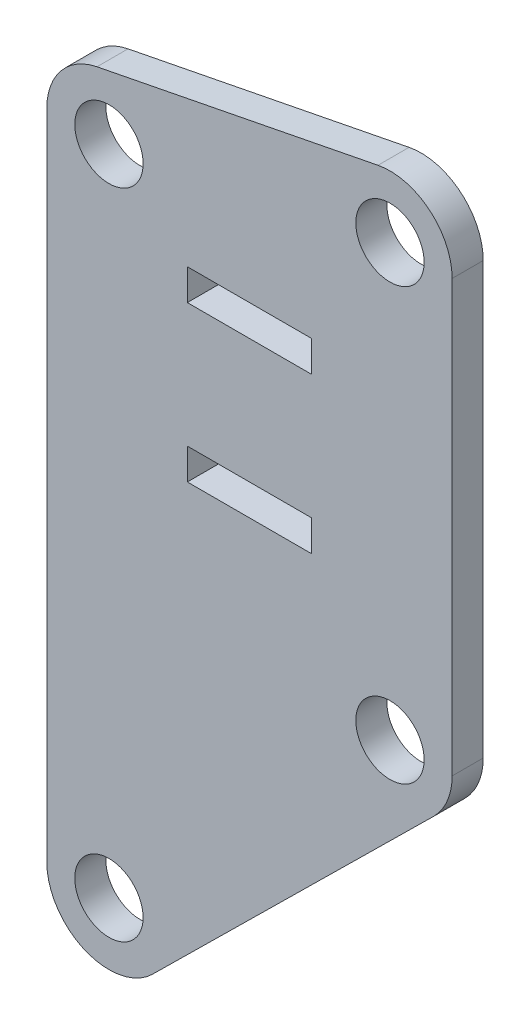
ISO-10303-21;
HEADER;
FILE_DESCRIPTION(('STEP AP214'),'2;1');
FILE_NAME('part.step','',(''),(''),'','','');
FILE_SCHEMA(('AUTOMOTIVE_DESIGN { 1 0 10303 214 1 1 1 1 }'));
ENDSEC;
DATA;
#1=APPLICATION_CONTEXT('core data for automotive mechanical design processes');
#2=APPLICATION_PROTOCOL_DEFINITION('international standard','automotive_design',2000,#1);
#3=PRODUCT_CONTEXT('',#1,'mechanical');
#4=PRODUCT('Part','Part','',(#3));
#5=PRODUCT_RELATED_PRODUCT_CATEGORY('part','',(#4));
#6=PRODUCT_DEFINITION_FORMATION('','',#4);
#7=PRODUCT_DEFINITION_CONTEXT('part definition',#1,'design');
#8=PRODUCT_DEFINITION('design','',#6,#7);
#9=PRODUCT_DEFINITION_SHAPE('','',#8);
#10=(LENGTH_UNIT() NAMED_UNIT(*) SI_UNIT(.MILLI.,.METRE.));
#11=(NAMED_UNIT(*) PLANE_ANGLE_UNIT() SI_UNIT($,.RADIAN.));
#12=(NAMED_UNIT(*) SI_UNIT($,.STERADIAN.) SOLID_ANGLE_UNIT());
#13=UNCERTAINTY_MEASURE_WITH_UNIT(LENGTH_MEASURE(1.E-05),#10,'distance_accuracy_value','');
#14=(GEOMETRIC_REPRESENTATION_CONTEXT(3) GLOBAL_UNCERTAINTY_ASSIGNED_CONTEXT((#13)) GLOBAL_UNIT_ASSIGNED_CONTEXT((#10,
#11,#12)) REPRESENTATION_CONTEXT('',''));
#15=CARTESIAN_POINT('',(0.,0.,0.));
#16=DIRECTION('',(0.,0.,1.));
#17=DIRECTION('',(1.,0.,0.));
#18=AXIS2_PLACEMENT_3D('',#15,#16,#17);
#19=CARTESIAN_POINT('',(-22.6126063288709,-56.9697358613956,5.));
#20=DIRECTION('',(0.,0.,-1.));
#21=DIRECTION('',(-1.,0.,0.));
#22=AXIS2_PLACEMENT_3D('',#19,#20,#21);
#23=CYLINDRICAL_SURFACE('',#22,10.);
#24=CARTESIAN_POINT('',(-22.6126063288709,-56.9697358613956,0.));
#25=DIRECTION('',(0.,0.,1.));
#26=DIRECTION('',(1.,0.,0.));
#27=AXIS2_PLACEMENT_3D('',#24,#25,#26);
#28=CIRCLE('',#27,10.);
#29=CARTESIAN_POINT('',(-32.6126063288709,-56.9697358613957,0.));
#30=VERTEX_POINT('',#29);
#31=CARTESIAN_POINT('',(-15.5903831558637,-64.0893132160201,0.));
#32=VERTEX_POINT('',#31);
#33=EDGE_CURVE('E204',#30,#32,#28,.T.);
#34=ORIENTED_EDGE('',*,*,#33,.T.);
#35=DIRECTION('',(0.,0.,-1.));
#36=VECTOR('',#35,1.);
#37=CARTESIAN_POINT('',(-15.5903831558637,-64.0893132160201,5.));
#38=LINE('',#37,#36);
#39=CARTESIAN_POINT('',(-15.5903831558637,-64.0893132160201,5.));
#40=VERTEX_POINT('',#39);
#41=EDGE_CURVE('E11',#40,#32,#38,.T.);
#42=ORIENTED_EDGE('',*,*,#41,.F.);
#43=CARTESIAN_POINT('',(-22.6126063288709,-56.9697358613956,5.));
#44=DIRECTION('',(0.,0.,1.));
#45=DIRECTION('',(1.,0.,0.));
#46=AXIS2_PLACEMENT_3D('',#43,#44,#45);
#47=CIRCLE('',#46,10.);
#48=CARTESIAN_POINT('',(-32.6126063288709,-56.9697358613957,5.));
#49=VERTEX_POINT('',#48);
#50=EDGE_CURVE('E253',#49,#40,#47,.T.);
#51=ORIENTED_EDGE('',*,*,#50,.F.);
#52=DIRECTION('',(0.,0.,-1.));
#53=VECTOR('',#52,1.);
#54=CARTESIAN_POINT('',(-32.6126063288709,-56.9697358613957,5.));
#55=LINE('',#54,#53);
#56=EDGE_CURVE('E279',#49,#30,#55,.T.);
#57=ORIENTED_EDGE('',*,*,#56,.T.);
#58=EDGE_LOOP('',(#34,#42,#51,#57));
#59=FACE_BOUND('',#58,.T.);
#60=ADVANCED_FACE('F42',(#59),#23,.T.);
#61=CARTESIAN_POINT('',(-15.5903831558637,-64.0893132160201,5.));
#62=DIRECTION('',(-0.702222317300717,0.711957735462444,0.));
#63=DIRECTION('',(-0.711957735462444,-0.702222317300717,0.));
#64=AXIS2_PLACEMENT_3D('',#61,#62,#63);
#65=PLANE('',#64);
#66=DIRECTION('',(0.711957735462444,0.702222317300717,0.));
#67=VECTOR('',#66,1.);
#68=CARTESIAN_POINT('',(-15.5903831558637,-64.0893132160201,0.));
#69=LINE('',#68,#67);
#70=CARTESIAN_POINT('',(29.6348295018789,-19.4825169820982,0.));
#71=VERTEX_POINT('',#70);
#72=EDGE_CURVE('E283',#32,#71,#69,.T.);
#73=ORIENTED_EDGE('',*,*,#72,.T.);
#74=DIRECTION('',(0.,0.,-1.));
#75=VECTOR('',#74,1.);
#76=CARTESIAN_POINT('',(29.6348295018789,-19.4825169820982,5.));
#77=LINE('',#76,#75);
#78=CARTESIAN_POINT('',(29.6348295018789,-19.4825169820982,5.));
#79=VERTEX_POINT('',#78);
#80=EDGE_CURVE('E50',#79,#71,#77,.T.);
#81=ORIENTED_EDGE('',*,*,#80,.F.);
#82=DIRECTION('',(0.711957735462444,0.702222317300717,0.));
#83=VECTOR('',#82,1.);
#84=CARTESIAN_POINT('',(-15.5903831558637,-64.0893132160201,5.));
#85=LINE('',#84,#83);
#86=EDGE_CURVE('E257',#40,#79,#85,.T.);
#87=ORIENTED_EDGE('',*,*,#86,.F.);
#88=ORIENTED_EDGE('',*,*,#41,.T.);
#89=EDGE_LOOP('',(#73,#81,#87,#88));
#90=FACE_BOUND('',#89,.T.);
#91=ADVANCED_FACE('F353',(#90),#65,.F.);
#92=CARTESIAN_POINT('',(22.6126063288717,-12.3629396274737,5.));
#93=DIRECTION('',(0.,0.,-1.));
#94=DIRECTION('',(-1.,0.,0.));
#95=AXIS2_PLACEMENT_3D('',#92,#93,#94);
#96=CYLINDRICAL_SURFACE('',#95,10.);
#97=CARTESIAN_POINT('',(22.6126063288717,-12.3629396274737,0.));
#98=DIRECTION('',(0.,0.,1.));
#99=DIRECTION('',(1.,0.,0.));
#100=AXIS2_PLACEMENT_3D('',#97,#98,#99);
#101=CIRCLE('',#100,10.);
#102=CARTESIAN_POINT('',(32.6126063288717,-12.3629396274737,0.));
#103=VERTEX_POINT('',#102);
#104=EDGE_CURVE('E286',#71,#103,#101,.T.);
#105=ORIENTED_EDGE('',*,*,#104,.T.);
#106=DIRECTION('',(0.,0.,-1.));
#107=VECTOR('',#106,1.);
#108=CARTESIAN_POINT('',(32.6126063288717,-12.3629396274737,5.));
#109=LINE('',#108,#107);
#110=CARTESIAN_POINT('',(32.6126063288717,-12.3629396274737,5.));
#111=VERTEX_POINT('',#110);
#112=EDGE_CURVE('E322',#111,#103,#109,.T.);
#113=ORIENTED_EDGE('',*,*,#112,.F.);
#114=CARTESIAN_POINT('',(22.6126063288717,-12.3629396274737,5.));
#115=DIRECTION('',(0.,0.,1.));
#116=DIRECTION('',(1.,0.,0.));
#117=AXIS2_PLACEMENT_3D('',#114,#115,#116);
#118=CIRCLE('',#117,10.);
#119=EDGE_CURVE('E261',#79,#111,#118,.T.);
#120=ORIENTED_EDGE('',*,*,#119,.F.);
#121=ORIENTED_EDGE('',*,*,#80,.T.);
#122=EDGE_LOOP('',(#105,#113,#120,#121));
#123=FACE_BOUND('',#122,.T.);
#124=ADVANCED_FACE('F331',(#123),#96,.T.);
#125=CARTESIAN_POINT('',(32.6126063288717,-12.3629396274737,5.));
#126=DIRECTION('',(-1.,0.,0.));
#127=DIRECTION('',(0.,-1.,0.));
#128=AXIS2_PLACEMENT_3D('',#125,#126,#127);
#129=PLANE('',#128);
#130=DIRECTION('',(0.,1.,0.));
#131=VECTOR('',#130,1.);
#132=CARTESIAN_POINT('',(32.6126063288717,-12.3629396274737,0.));
#133=LINE('',#132,#131);
#134=CARTESIAN_POINT('',(32.6126063288716,56.9697358613957,0.));
#135=VERTEX_POINT('',#134);
#136=EDGE_CURVE('E289',#103,#135,#133,.T.);
#137=ORIENTED_EDGE('',*,*,#136,.T.);
#138=DIRECTION('',(0.,0.,-1.));
#139=VECTOR('',#138,1.);
#140=CARTESIAN_POINT('',(32.6126063288716,56.9697358613957,5.));
#141=LINE('',#140,#139);
#142=CARTESIAN_POINT('',(32.6126063288716,56.9697358613957,5.));
#143=VERTEX_POINT('',#142);
#144=EDGE_CURVE('E318',#143,#135,#141,.T.);
#145=ORIENTED_EDGE('',*,*,#144,.F.);
#146=DIRECTION('',(0.,1.,0.));
#147=VECTOR('',#146,1.);
#148=CARTESIAN_POINT('',(32.6126063288717,-12.3629396274737,5.));
#149=LINE('',#148,#147);
#150=EDGE_CURVE('E264',#111,#143,#149,.T.);
#151=ORIENTED_EDGE('',*,*,#150,.F.);
#152=ORIENTED_EDGE('',*,*,#112,.T.);
#153=EDGE_LOOP('',(#137,#145,#151,#152));
#154=FACE_BOUND('',#153,.T.);
#155=ADVANCED_FACE('F341',(#154),#129,.F.);
#156=CARTESIAN_POINT('',(22.6126063288717,56.9697358613957,5.));
#157=DIRECTION('',(0.,0.,-1.));
#158=DIRECTION('',(-1.,0.,0.));
#159=AXIS2_PLACEMENT_3D('',#156,#157,#158);
#160=CYLINDRICAL_SURFACE('',#159,9.99999999999998);
#161=CARTESIAN_POINT('',(22.6126063288717,56.9697358613957,0.));
#162=DIRECTION('',(0.,0.,1.));
#163=DIRECTION('',(1.,0.,0.));
#164=AXIS2_PLACEMENT_3D('',#161,#162,#163);
#165=CIRCLE('',#164,9.99999999999998);
#166=CARTESIAN_POINT('',(20.6847321423296,66.7821413320672,0.));
#167=VERTEX_POINT('',#166);
#168=EDGE_CURVE('E292',#135,#167,#165,.T.);
#169=ORIENTED_EDGE('',*,*,#168,.T.);
#170=DIRECTION('',(0.,0.,-1.));
#171=VECTOR('',#170,1.);
#172=CARTESIAN_POINT('',(20.6847321423296,66.7821413320672,5.));
#173=LINE('',#172,#171);
#174=CARTESIAN_POINT('',(20.6847321423296,66.7821413320672,5.));
#175=VERTEX_POINT('',#174);
#176=EDGE_CURVE('E314',#175,#167,#173,.T.);
#177=ORIENTED_EDGE('',*,*,#176,.F.);
#178=CARTESIAN_POINT('',(22.6126063288717,56.9697358613957,5.));
#179=DIRECTION('',(0.,0.,1.));
#180=DIRECTION('',(1.,0.,0.));
#181=AXIS2_PLACEMENT_3D('',#178,#179,#180);
#182=CIRCLE('',#181,9.99999999999998);
#183=EDGE_CURVE('E267',#143,#175,#182,.T.);
#184=ORIENTED_EDGE('',*,*,#183,.F.);
#185=ORIENTED_EDGE('',*,*,#144,.T.);
#186=EDGE_LOOP('',(#169,#177,#184,#185));
#187=FACE_BOUND('',#186,.T.);
#188=ADVANCED_FACE('F345',(#187),#160,.T.);
#189=CARTESIAN_POINT('',(20.6847321423296,66.7821413320672,5.));
#190=DIRECTION('',(0.192787418654207,-0.981240547067154,0.));
#191=DIRECTION('',(0.981240547067154,0.192787418654207,0.));
#192=AXIS2_PLACEMENT_3D('',#189,#190,#191);
#193=PLANE('',#192);
#194=DIRECTION('',(-0.981240547067154,-0.192787418654207,0.));
#195=VECTOR('',#194,1.);
#196=CARTESIAN_POINT('',(20.6847321423296,66.7821413320672,0.));
#197=LINE('',#196,#195);
#198=CARTESIAN_POINT('',(-24.5404805154138,57.8966014586551,0.));
#199=VERTEX_POINT('',#198);
#200=EDGE_CURVE('E295',#167,#199,#197,.T.);
#201=ORIENTED_EDGE('',*,*,#200,.T.);
#202=DIRECTION('',(0.,0.,-1.));
#203=VECTOR('',#202,1.);
#204=CARTESIAN_POINT('',(-24.5404805154138,57.8966014586551,5.));
#205=LINE('',#204,#203);
#206=CARTESIAN_POINT('',(-24.5404805154138,57.8966014586551,5.));
#207=VERTEX_POINT('',#206);
#208=EDGE_CURVE('E310',#207,#199,#205,.T.);
#209=ORIENTED_EDGE('',*,*,#208,.F.);
#210=DIRECTION('',(-0.981240547067154,-0.192787418654207,0.));
#211=VECTOR('',#210,1.);
#212=CARTESIAN_POINT('',(20.6847321423296,66.7821413320672,5.));
#213=LINE('',#212,#211);
#214=EDGE_CURVE('E270',#175,#207,#213,.T.);
#215=ORIENTED_EDGE('',*,*,#214,.F.);
#216=ORIENTED_EDGE('',*,*,#176,.T.);
#217=EDGE_LOOP('',(#201,#209,#215,#216));
#218=FACE_BOUND('',#217,.T.);
#219=ADVANCED_FACE('F366',(#218),#193,.F.);
#220=CARTESIAN_POINT('',(-22.6126063288717,48.0841959879835,5.));
#221=DIRECTION('',(0.,0.,-1.));
#222=DIRECTION('',(-1.,0.,0.));
#223=AXIS2_PLACEMENT_3D('',#220,#221,#222);
#224=CYLINDRICAL_SURFACE('',#223,10.);
#225=CARTESIAN_POINT('',(-22.6126063288717,48.0841959879835,0.));
#226=DIRECTION('',(0.,0.,1.));
#227=DIRECTION('',(1.,0.,0.));
#228=AXIS2_PLACEMENT_3D('',#225,#226,#227);
#229=CIRCLE('',#228,10.);
#230=CARTESIAN_POINT('',(-32.6126063288717,48.0841959879835,0.));
#231=VERTEX_POINT('',#230);
#232=EDGE_CURVE('E298',#199,#231,#229,.T.);
#233=ORIENTED_EDGE('',*,*,#232,.T.);
#234=DIRECTION('',(0.,0.,-1.));
#235=VECTOR('',#234,1.);
#236=CARTESIAN_POINT('',(-32.6126063288717,48.0841959879835,5.));
#237=LINE('',#236,#235);
#238=CARTESIAN_POINT('',(-32.6126063288717,48.0841959879835,5.));
#239=VERTEX_POINT('',#238);
#240=EDGE_CURVE('E306',#239,#231,#237,.T.);
#241=ORIENTED_EDGE('',*,*,#240,.F.);
#242=CARTESIAN_POINT('',(-22.6126063288717,48.0841959879835,5.));
#243=DIRECTION('',(0.,0.,1.));
#244=DIRECTION('',(1.,0.,0.));
#245=AXIS2_PLACEMENT_3D('',#242,#243,#244);
#246=CIRCLE('',#245,10.);
#247=EDGE_CURVE('E273',#207,#239,#246,.T.);
#248=ORIENTED_EDGE('',*,*,#247,.F.);
#249=ORIENTED_EDGE('',*,*,#208,.T.);
#250=EDGE_LOOP('',(#233,#241,#248,#249));
#251=FACE_BOUND('',#250,.T.);
#252=ADVANCED_FACE('F364',(#251),#224,.T.);
#253=CARTESIAN_POINT('',(-32.6126063288717,48.0841959879835,5.));
#254=DIRECTION('',(1.,0.,0.));
#255=DIRECTION('',(0.,1.,0.));
#256=AXIS2_PLACEMENT_3D('',#253,#254,#255);
#257=PLANE('',#256);
#258=DIRECTION('',(0.,-1.,0.));
#259=VECTOR('',#258,1.);
#260=CARTESIAN_POINT('',(-32.6126063288717,48.0841959879835,0.));
#261=LINE('',#260,#259);
#262=EDGE_CURVE('E258',#231,#30,#261,.T.);
#263=ORIENTED_EDGE('',*,*,#262,.T.);
#264=ORIENTED_EDGE('',*,*,#56,.F.);
#265=DIRECTION('',(0.,-1.,0.));
#266=VECTOR('',#265,1.);
#267=CARTESIAN_POINT('',(-32.6126063288717,48.0841959879835,5.));
#268=LINE('',#267,#266);
#269=EDGE_CURVE('E276',#239,#49,#268,.T.);
#270=ORIENTED_EDGE('',*,*,#269,.F.);
#271=ORIENTED_EDGE('',*,*,#240,.T.);
#272=EDGE_LOOP('',(#263,#264,#270,#271));
#273=FACE_BOUND('',#272,.T.);
#274=ADVANCED_FACE('F359',(#273),#257,.F.);
#275=CARTESIAN_POINT('',(-22.6126063288709,-56.9697358613956,5.));
#276=DIRECTION('',(0.,0.,1.));
#277=DIRECTION('',(1.,0.,0.));
#278=AXIS2_PLACEMENT_3D('',#275,#276,#277);
#279=PLANE('',#278);
#280=CARTESIAN_POINT('',(-22.6126063288709,-56.9697358613956,5.));
#281=DIRECTION('',(0.,0.,1.));
#282=DIRECTION('',(1.,0.,0.));
#283=AXIS2_PLACEMENT_3D('',#280,#281,#282);
#284=CIRCLE('',#283,5.5);
#285=CARTESIAN_POINT('',(-17.1126063288709,-56.9697358613956,5.));
#286=VERTEX_POINT('',#285);
#287=EDGE_CURVE('E611',#286,#286,#284,.T.);
#288=ORIENTED_EDGE('',*,*,#287,.F.);
#289=EDGE_LOOP('',(#288));
#290=FACE_BOUND('',#289,.T.);
#291=CARTESIAN_POINT('',(22.6126063288717,56.9697358613957,5.));
#292=DIRECTION('',(0.,0.,1.));
#293=DIRECTION('',(1.,0.,0.));
#294=AXIS2_PLACEMENT_3D('',#291,#292,#293);
#295=CIRCLE('',#294,5.5);
#296=CARTESIAN_POINT('',(28.1126063288717,56.9697358613957,5.));
#297=VERTEX_POINT('',#296);
#298=EDGE_CURVE('E613',#297,#297,#295,.T.);
#299=ORIENTED_EDGE('',*,*,#298,.F.);
#300=EDGE_LOOP('',(#299));
#301=FACE_BOUND('',#300,.T.);
#302=CARTESIAN_POINT('',(-22.6126063288717,48.0841959879835,5.));
#303=DIRECTION('',(0.,0.,1.));
#304=DIRECTION('',(1.,0.,0.));
#305=AXIS2_PLACEMENT_3D('',#302,#303,#304);
#306=CIRCLE('',#305,5.5);
#307=CARTESIAN_POINT('',(-17.1126063288717,48.0841959879835,5.));
#308=VERTEX_POINT('',#307);
#309=EDGE_CURVE('E625',#308,#308,#306,.T.);
#310=ORIENTED_EDGE('',*,*,#309,.F.);
#311=EDGE_LOOP('',(#310));
#312=FACE_BOUND('',#311,.T.);
#313=CARTESIAN_POINT('',(22.6126063288717,-12.3629396274737,5.));
#314=DIRECTION('',(0.,0.,1.));
#315=DIRECTION('',(1.,0.,0.));
#316=AXIS2_PLACEMENT_3D('',#313,#314,#315);
#317=CIRCLE('',#316,5.5);
#318=CARTESIAN_POINT('',(28.1126063288717,-12.3629396274737,5.));
#319=VERTEX_POINT('',#318);
#320=EDGE_CURVE('E632',#319,#319,#317,.T.);
#321=ORIENTED_EDGE('',*,*,#320,.F.);
#322=EDGE_LOOP('',(#321));
#323=FACE_BOUND('',#322,.T.);
#324=DIRECTION('',(0.,1.,0.));
#325=VECTOR('',#324,1.);
#326=CARTESIAN_POINT('',(10.0000000000001,32.303398116961,5.));
#327=LINE('',#326,#325);
#328=CARTESIAN_POINT('',(10.0000000000001,32.303398116961,5.));
#329=VERTEX_POINT('',#328);
#330=CARTESIAN_POINT('',(10.0000000000001,37.303398116961,5.));
#331=VERTEX_POINT('',#330);
#332=EDGE_CURVE('E57',#329,#331,#327,.T.);
#333=ORIENTED_EDGE('',*,*,#332,.F.);
#334=DIRECTION('',(1.,0.,0.));
#335=VECTOR('',#334,1.);
#336=CARTESIAN_POINT('',(10.0000000000001,32.303398116961,5.));
#337=LINE('',#336,#335);
#338=CARTESIAN_POINT('',(-9.99999999999993,32.303398116961,5.));
#339=VERTEX_POINT('',#338);
#340=EDGE_CURVE('E179',#339,#329,#337,.T.);
#341=ORIENTED_EDGE('',*,*,#340,.F.);
#342=DIRECTION('',(0.,-1.,0.));
#343=VECTOR('',#342,1.);
#344=CARTESIAN_POINT('',(-9.99999999999993,32.303398116961,5.));
#345=LINE('',#344,#343);
#346=CARTESIAN_POINT('',(-9.99999999999993,37.303398116961,5.));
#347=VERTEX_POINT('',#346);
#348=EDGE_CURVE('E183',#347,#339,#345,.T.);
#349=ORIENTED_EDGE('',*,*,#348,.F.);
#350=DIRECTION('',(-1.,0.,0.));
#351=VECTOR('',#350,1.);
#352=CARTESIAN_POINT('',(10.0000000000001,37.303398116961,5.));
#353=LINE('',#352,#351);
#354=EDGE_CURVE('E195',#331,#347,#353,.T.);
#355=ORIENTED_EDGE('',*,*,#354,.F.);
#356=EDGE_LOOP('',(#333,#341,#349,#355));
#357=FACE_BOUND('',#356,.T.);
#358=DIRECTION('',(0.,-1.,0.));
#359=VECTOR('',#358,1.);
#360=CARTESIAN_POINT('',(-9.99999999999993,12.303398116961,5.));
#361=LINE('',#360,#359);
#362=CARTESIAN_POINT('',(-9.99999999999993,12.303398116961,5.));
#363=VERTEX_POINT('',#362);
#364=CARTESIAN_POINT('',(-9.99999999999993,7.303398116961,5.));
#365=VERTEX_POINT('',#364);
#366=EDGE_CURVE('E65',#363,#365,#361,.T.);
#367=ORIENTED_EDGE('',*,*,#366,.F.);
#368=DIRECTION('',(-1.,0.,0.));
#369=VECTOR('',#368,1.);
#370=CARTESIAN_POINT('',(10.0000000000001,12.303398116961,5.));
#371=LINE('',#370,#369);
#372=CARTESIAN_POINT('',(10.0000000000001,12.303398116961,5.));
#373=VERTEX_POINT('',#372);
#374=EDGE_CURVE('E224',#373,#363,#371,.T.);
#375=ORIENTED_EDGE('',*,*,#374,.F.);
#376=DIRECTION('',(0.,1.,0.));
#377=VECTOR('',#376,1.);
#378=CARTESIAN_POINT('',(10.0000000000001,12.303398116961,5.));
#379=LINE('',#378,#377);
#380=CARTESIAN_POINT('',(10.0000000000001,7.303398116961,5.));
#381=VERTEX_POINT('',#380);
#382=EDGE_CURVE('E228',#381,#373,#379,.T.);
#383=ORIENTED_EDGE('',*,*,#382,.F.);
#384=DIRECTION('',(1.,0.,0.));
#385=VECTOR('',#384,1.);
#386=CARTESIAN_POINT('',(10.0000000000001,7.303398116961,5.));
#387=LINE('',#386,#385);
#388=EDGE_CURVE('E233',#365,#381,#387,.T.);
#389=ORIENTED_EDGE('',*,*,#388,.F.);
#390=EDGE_LOOP('',(#367,#375,#383,#389));
#391=FACE_BOUND('',#390,.T.);
#392=ORIENTED_EDGE('',*,*,#50,.T.);
#393=ORIENTED_EDGE('',*,*,#86,.T.);
#394=ORIENTED_EDGE('',*,*,#119,.T.);
#395=ORIENTED_EDGE('',*,*,#150,.T.);
#396=ORIENTED_EDGE('',*,*,#183,.T.);
#397=ORIENTED_EDGE('',*,*,#214,.T.);
#398=ORIENTED_EDGE('',*,*,#247,.T.);
#399=ORIENTED_EDGE('',*,*,#269,.T.);
#400=EDGE_LOOP('',(#392,#393,#394,#395,#396,#397,#398,#399));
#401=FACE_BOUND('',#400,.T.);
#402=ADVANCED_FACE('F349',(#290,#301,#312,#323,#357,#391,#401),#279,.T.);
#403=CARTESIAN_POINT('',(-22.6126063288709,-56.9697358613956,0.));
#404=DIRECTION('',(0.,0.,1.));
#405=DIRECTION('',(1.,0.,0.));
#406=AXIS2_PLACEMENT_3D('',#403,#404,#405);
#407=PLANE('',#406);
#408=CARTESIAN_POINT('',(-22.6126063288709,-56.9697358613956,0.));
#409=DIRECTION('',(0.,0.,1.));
#410=DIRECTION('',(1.,0.,0.));
#411=AXIS2_PLACEMENT_3D('',#408,#409,#410);
#412=CIRCLE('',#411,5.5);
#413=CARTESIAN_POINT('',(-17.1126063288709,-56.9697358613956,0.));
#414=VERTEX_POINT('',#413);
#415=EDGE_CURVE('E223',#414,#414,#412,.T.);
#416=ORIENTED_EDGE('',*,*,#415,.T.);
#417=EDGE_LOOP('',(#416));
#418=FACE_BOUND('',#417,.T.);
#419=CARTESIAN_POINT('',(22.6126063288717,56.9697358613957,0.));
#420=DIRECTION('',(0.,0.,1.));
#421=DIRECTION('',(1.,0.,0.));
#422=AXIS2_PLACEMENT_3D('',#419,#420,#421);
#423=CIRCLE('',#422,5.5);
#424=CARTESIAN_POINT('',(28.1126063288717,56.9697358613957,0.));
#425=VERTEX_POINT('',#424);
#426=EDGE_CURVE('E619',#425,#425,#423,.T.);
#427=ORIENTED_EDGE('',*,*,#426,.T.);
#428=EDGE_LOOP('',(#427));
#429=FACE_BOUND('',#428,.T.);
#430=CARTESIAN_POINT('',(-22.6126063288717,48.0841959879835,0.));
#431=DIRECTION('',(0.,0.,1.));
#432=DIRECTION('',(1.,0.,0.));
#433=AXIS2_PLACEMENT_3D('',#430,#431,#432);
#434=CIRCLE('',#433,5.5);
#435=CARTESIAN_POINT('',(-17.1126063288717,48.0841959879835,0.));
#436=VERTEX_POINT('',#435);
#437=EDGE_CURVE('E629',#436,#436,#434,.T.);
#438=ORIENTED_EDGE('',*,*,#437,.T.);
#439=EDGE_LOOP('',(#438));
#440=FACE_BOUND('',#439,.T.);
#441=CARTESIAN_POINT('',(22.6126063288717,-12.3629396274737,0.));
#442=DIRECTION('',(0.,0.,1.));
#443=DIRECTION('',(1.,0.,0.));
#444=AXIS2_PLACEMENT_3D('',#441,#442,#443);
#445=CIRCLE('',#444,5.5);
#446=CARTESIAN_POINT('',(28.1126063288717,-12.3629396274737,0.));
#447=VERTEX_POINT('',#446);
#448=EDGE_CURVE('E186',#447,#447,#445,.T.);
#449=ORIENTED_EDGE('',*,*,#448,.T.);
#450=EDGE_LOOP('',(#449));
#451=FACE_BOUND('',#450,.T.);
#452=DIRECTION('',(1.,0.,0.));
#453=VECTOR('',#452,1.);
#454=CARTESIAN_POINT('',(10.0000000000001,32.303398116961,0.));
#455=LINE('',#454,#453);
#456=CARTESIAN_POINT('',(-9.99999999999993,32.303398116961,0.));
#457=VERTEX_POINT('',#456);
#458=CARTESIAN_POINT('',(10.0000000000001,32.303398116961,0.));
#459=VERTEX_POINT('',#458);
#460=EDGE_CURVE('E164',#457,#459,#455,.T.);
#461=ORIENTED_EDGE('',*,*,#460,.T.);
#462=DIRECTION('',(0.,1.,0.));
#463=VECTOR('',#462,1.);
#464=CARTESIAN_POINT('',(10.0000000000001,32.303398116961,0.));
#465=LINE('',#464,#463);
#466=CARTESIAN_POINT('',(10.0000000000001,37.303398116961,0.));
#467=VERTEX_POINT('',#466);
#468=EDGE_CURVE('E157',#459,#467,#465,.T.);
#469=ORIENTED_EDGE('',*,*,#468,.T.);
#470=DIRECTION('',(-1.,0.,0.));
#471=VECTOR('',#470,1.);
#472=CARTESIAN_POINT('',(10.0000000000001,37.303398116961,0.));
#473=LINE('',#472,#471);
#474=CARTESIAN_POINT('',(-9.99999999999993,37.303398116961,0.));
#475=VERTEX_POINT('',#474);
#476=EDGE_CURVE('E168',#467,#475,#473,.T.);
#477=ORIENTED_EDGE('',*,*,#476,.T.);
#478=DIRECTION('',(0.,-1.,0.));
#479=VECTOR('',#478,1.);
#480=CARTESIAN_POINT('',(-9.99999999999993,32.303398116961,0.));
#481=LINE('',#480,#479);
#482=EDGE_CURVE('E173',#475,#457,#481,.T.);
#483=ORIENTED_EDGE('',*,*,#482,.T.);
#484=EDGE_LOOP('',(#461,#469,#477,#483));
#485=FACE_BOUND('',#484,.T.);
#486=DIRECTION('',(-1.,0.,0.));
#487=VECTOR('',#486,1.);
#488=CARTESIAN_POINT('',(10.0000000000001,12.303398116961,0.));
#489=LINE('',#488,#487);
#490=CARTESIAN_POINT('',(10.0000000000001,12.303398116961,0.));
#491=VERTEX_POINT('',#490);
#492=CARTESIAN_POINT('',(-9.99999999999993,12.303398116961,0.));
#493=VERTEX_POINT('',#492);
#494=EDGE_CURVE('E213',#491,#493,#489,.T.);
#495=ORIENTED_EDGE('',*,*,#494,.T.);
#496=DIRECTION('',(0.,-1.,0.));
#497=VECTOR('',#496,1.);
#498=CARTESIAN_POINT('',(-9.99999999999993,12.303398116961,0.));
#499=LINE('',#498,#497);
#500=CARTESIAN_POINT('',(-9.99999999999993,7.303398116961,0.));
#501=VERTEX_POINT('',#500);
#502=EDGE_CURVE('E229',#493,#501,#499,.T.);
#503=ORIENTED_EDGE('',*,*,#502,.T.);
#504=DIRECTION('',(1.,0.,0.));
#505=VECTOR('',#504,1.);
#506=CARTESIAN_POINT('',(10.0000000000001,7.303398116961,0.));
#507=LINE('',#506,#505);
#508=CARTESIAN_POINT('',(10.0000000000001,7.303398116961,0.));
#509=VERTEX_POINT('',#508);
#510=EDGE_CURVE('E246',#501,#509,#507,.T.);
#511=ORIENTED_EDGE('',*,*,#510,.T.);
#512=DIRECTION('',(0.,1.,0.));
#513=VECTOR('',#512,1.);
#514=CARTESIAN_POINT('',(10.0000000000001,12.303398116961,0.));
#515=LINE('',#514,#513);
#516=EDGE_CURVE('E242',#509,#491,#515,.T.);
#517=ORIENTED_EDGE('',*,*,#516,.T.);
#518=EDGE_LOOP('',(#495,#503,#511,#517));
#519=FACE_BOUND('',#518,.T.);
#520=ORIENTED_EDGE('',*,*,#33,.F.);
#521=ORIENTED_EDGE('',*,*,#262,.F.);
#522=ORIENTED_EDGE('',*,*,#232,.F.);
#523=ORIENTED_EDGE('',*,*,#200,.F.);
#524=ORIENTED_EDGE('',*,*,#168,.F.);
#525=ORIENTED_EDGE('',*,*,#136,.F.);
#526=ORIENTED_EDGE('',*,*,#104,.F.);
#527=ORIENTED_EDGE('',*,*,#72,.F.);
#528=EDGE_LOOP('',(#520,#521,#522,#523,#524,#525,#526,#527));
#529=FACE_BOUND('',#528,.T.);
#530=ADVANCED_FACE('F175',(#418,#429,#440,#451,#485,#519,#529),#407,.F.);
#531=CARTESIAN_POINT('',(-9.99999999999993,12.303398116961,0.));
#532=DIRECTION('',(-1.,0.,0.));
#533=DIRECTION('',(0.,0.,1.));
#534=AXIS2_PLACEMENT_3D('',#531,#532,#533);
#535=PLANE('',#534);
#536=ORIENTED_EDGE('',*,*,#366,.T.);
#537=DIRECTION('',(0.,0.,1.));
#538=VECTOR('',#537,1.);
#539=CARTESIAN_POINT('',(-9.99999999999993,7.303398116961,0.));
#540=LINE('',#539,#538);
#541=EDGE_CURVE('E210',#501,#365,#540,.T.);
#542=ORIENTED_EDGE('',*,*,#541,.F.);
#543=ORIENTED_EDGE('',*,*,#502,.F.);
#544=DIRECTION('',(0.,0.,1.));
#545=VECTOR('',#544,1.);
#546=CARTESIAN_POINT('',(-9.99999999999993,12.303398116961,0.));
#547=LINE('',#546,#545);
#548=EDGE_CURVE('E220',#493,#363,#547,.T.);
#549=ORIENTED_EDGE('',*,*,#548,.T.);
#550=EDGE_LOOP('',(#536,#542,#543,#549));
#551=FACE_BOUND('',#550,.T.);
#552=ADVANCED_FACE('F422',(#551),#535,.F.);
#553=CARTESIAN_POINT('',(10.0000000000001,12.303398116961,0.));
#554=DIRECTION('',(0.,1.,0.));
#555=DIRECTION('',(0.,0.,1.));
#556=AXIS2_PLACEMENT_3D('',#553,#554,#555);
#557=PLANE('',#556);
#558=ORIENTED_EDGE('',*,*,#374,.T.);
#559=ORIENTED_EDGE('',*,*,#548,.F.);
#560=ORIENTED_EDGE('',*,*,#494,.F.);
#561=DIRECTION('',(0.,0.,1.));
#562=VECTOR('',#561,1.);
#563=CARTESIAN_POINT('',(10.0000000000001,12.303398116961,0.));
#564=LINE('',#563,#562);
#565=EDGE_CURVE('E217',#491,#373,#564,.T.);
#566=ORIENTED_EDGE('',*,*,#565,.T.);
#567=EDGE_LOOP('',(#558,#559,#560,#566));
#568=FACE_BOUND('',#567,.T.);
#569=ADVANCED_FACE('F427',(#568),#557,.F.);
#570=CARTESIAN_POINT('',(10.0000000000001,12.303398116961,0.));
#571=DIRECTION('',(1.,0.,0.));
#572=DIRECTION('',(0.,0.,-1.));
#573=AXIS2_PLACEMENT_3D('',#570,#571,#572);
#574=PLANE('',#573);
#575=ORIENTED_EDGE('',*,*,#382,.T.);
#576=ORIENTED_EDGE('',*,*,#565,.F.);
#577=ORIENTED_EDGE('',*,*,#516,.F.);
#578=DIRECTION('',(0.,0.,1.));
#579=VECTOR('',#578,1.);
#580=CARTESIAN_POINT('',(10.0000000000001,7.303398116961,0.));
#581=LINE('',#580,#579);
#582=EDGE_CURVE('E214',#509,#381,#581,.T.);
#583=ORIENTED_EDGE('',*,*,#582,.T.);
#584=EDGE_LOOP('',(#575,#576,#577,#583));
#585=FACE_BOUND('',#584,.T.);
#586=ADVANCED_FACE('F439',(#585),#574,.F.);
#587=CARTESIAN_POINT('',(10.0000000000001,7.303398116961,0.));
#588=DIRECTION('',(0.,-1.,0.));
#589=DIRECTION('',(0.,0.,-1.));
#590=AXIS2_PLACEMENT_3D('',#587,#588,#589);
#591=PLANE('',#590);
#592=ORIENTED_EDGE('',*,*,#388,.T.);
#593=ORIENTED_EDGE('',*,*,#582,.F.);
#594=ORIENTED_EDGE('',*,*,#510,.F.);
#595=ORIENTED_EDGE('',*,*,#541,.T.);
#596=EDGE_LOOP('',(#592,#593,#594,#595));
#597=FACE_BOUND('',#596,.T.);
#598=ADVANCED_FACE('F450',(#597),#591,.F.);
#599=CARTESIAN_POINT('',(10.0000000000001,32.303398116961,0.));
#600=DIRECTION('',(1.,0.,0.));
#601=DIRECTION('',(0.,0.,-1.));
#602=AXIS2_PLACEMENT_3D('',#599,#600,#601);
#603=PLANE('',#602);
#604=ORIENTED_EDGE('',*,*,#332,.T.);
#605=DIRECTION('',(0.,0.,1.));
#606=VECTOR('',#605,1.);
#607=CARTESIAN_POINT('',(10.0000000000001,37.303398116961,0.));
#608=LINE('',#607,#606);
#609=EDGE_CURVE('E153',#467,#331,#608,.T.);
#610=ORIENTED_EDGE('',*,*,#609,.F.);
#611=ORIENTED_EDGE('',*,*,#468,.F.);
#612=DIRECTION('',(0.,0.,1.));
#613=VECTOR('',#612,1.);
#614=CARTESIAN_POINT('',(10.0000000000001,32.303398116961,0.));
#615=LINE('',#614,#613);
#616=EDGE_CURVE('E201',#459,#329,#615,.T.);
#617=ORIENTED_EDGE('',*,*,#616,.T.);
#618=EDGE_LOOP('',(#604,#610,#611,#617));
#619=FACE_BOUND('',#618,.T.);
#620=ADVANCED_FACE('F155',(#619),#603,.F.);
#621=CARTESIAN_POINT('',(10.0000000000001,32.303398116961,0.));
#622=DIRECTION('',(0.,-1.,0.));
#623=DIRECTION('',(0.,0.,-1.));
#624=AXIS2_PLACEMENT_3D('',#621,#622,#623);
#625=PLANE('',#624);
#626=ORIENTED_EDGE('',*,*,#340,.T.);
#627=ORIENTED_EDGE('',*,*,#616,.F.);
#628=ORIENTED_EDGE('',*,*,#460,.F.);
#629=DIRECTION('',(0.,0.,1.));
#630=VECTOR('',#629,1.);
#631=CARTESIAN_POINT('',(-9.99999999999993,32.303398116961,0.));
#632=LINE('',#631,#630);
#633=EDGE_CURVE('E205',#457,#339,#632,.T.);
#634=ORIENTED_EDGE('',*,*,#633,.T.);
#635=EDGE_LOOP('',(#626,#627,#628,#634));
#636=FACE_BOUND('',#635,.T.);
#637=ADVANCED_FACE('F471',(#636),#625,.F.);
#638=CARTESIAN_POINT('',(-9.99999999999993,32.303398116961,0.));
#639=DIRECTION('',(-1.,0.,0.));
#640=DIRECTION('',(0.,0.,1.));
#641=AXIS2_PLACEMENT_3D('',#638,#639,#640);
#642=PLANE('',#641);
#643=ORIENTED_EDGE('',*,*,#348,.T.);
#644=ORIENTED_EDGE('',*,*,#633,.F.);
#645=ORIENTED_EDGE('',*,*,#482,.F.);
#646=DIRECTION('',(0.,0.,1.));
#647=VECTOR('',#646,1.);
#648=CARTESIAN_POINT('',(-9.99999999999993,37.303398116961,0.));
#649=LINE('',#648,#647);
#650=EDGE_CURVE('E163',#475,#347,#649,.T.);
#651=ORIENTED_EDGE('',*,*,#650,.T.);
#652=EDGE_LOOP('',(#643,#644,#645,#651));
#653=FACE_BOUND('',#652,.T.);
#654=ADVANCED_FACE('F481',(#653),#642,.F.);
#655=CARTESIAN_POINT('',(10.0000000000001,37.303398116961,0.));
#656=DIRECTION('',(0.,1.,0.));
#657=DIRECTION('',(0.,0.,1.));
#658=AXIS2_PLACEMENT_3D('',#655,#656,#657);
#659=PLANE('',#658);
#660=ORIENTED_EDGE('',*,*,#354,.T.);
#661=ORIENTED_EDGE('',*,*,#650,.F.);
#662=ORIENTED_EDGE('',*,*,#476,.F.);
#663=ORIENTED_EDGE('',*,*,#609,.T.);
#664=EDGE_LOOP('',(#660,#661,#662,#663));
#665=FACE_BOUND('',#664,.T.);
#666=ADVANCED_FACE('F169',(#665),#659,.F.);
#667=CARTESIAN_POINT('',(22.6126063288717,-12.3629396274737,0.));
#668=DIRECTION('',(0.,0.,1.));
#669=DIRECTION('',(1.,0.,0.));
#670=AXIS2_PLACEMENT_3D('',#667,#668,#669);
#671=CYLINDRICAL_SURFACE('',#670,5.5);
#672=ORIENTED_EDGE('',*,*,#448,.F.);
#673=EDGE_LOOP('',(#672));
#674=FACE_BOUND('',#673,.T.);
#675=ORIENTED_EDGE('',*,*,#320,.T.);
#676=EDGE_LOOP('',(#675));
#677=FACE_BOUND('',#676,.T.);
#678=ADVANCED_FACE('F502',(#674,#677),#671,.F.);
#679=CARTESIAN_POINT('',(-22.6126063288717,48.0841959879835,0.));
#680=DIRECTION('',(0.,0.,1.));
#681=DIRECTION('',(1.,0.,0.));
#682=AXIS2_PLACEMENT_3D('',#679,#680,#681);
#683=CYLINDRICAL_SURFACE('',#682,5.5);
#684=ORIENTED_EDGE('',*,*,#437,.F.);
#685=EDGE_LOOP('',(#684));
#686=FACE_BOUND('',#685,.T.);
#687=ORIENTED_EDGE('',*,*,#309,.T.);
#688=EDGE_LOOP('',(#687));
#689=FACE_BOUND('',#688,.T.);
#690=ADVANCED_FACE('F522',(#686,#689),#683,.F.);
#691=CARTESIAN_POINT('',(22.6126063288717,56.9697358613957,0.));
#692=DIRECTION('',(0.,0.,1.));
#693=DIRECTION('',(1.,0.,0.));
#694=AXIS2_PLACEMENT_3D('',#691,#692,#693);
#695=CYLINDRICAL_SURFACE('',#694,5.5);
#696=ORIENTED_EDGE('',*,*,#426,.F.);
#697=EDGE_LOOP('',(#696));
#698=FACE_BOUND('',#697,.T.);
#699=ORIENTED_EDGE('',*,*,#298,.T.);
#700=EDGE_LOOP('',(#699));
#701=FACE_BOUND('',#700,.T.);
#702=ADVANCED_FACE('F533',(#698,#701),#695,.F.);
#703=CARTESIAN_POINT('',(-22.6126063288709,-56.9697358613956,0.));
#704=DIRECTION('',(0.,0.,1.));
#705=DIRECTION('',(1.,0.,0.));
#706=AXIS2_PLACEMENT_3D('',#703,#704,#705);
#707=CYLINDRICAL_SURFACE('',#706,5.5);
#708=ORIENTED_EDGE('',*,*,#415,.F.);
#709=EDGE_LOOP('',(#708));
#710=FACE_BOUND('',#709,.T.);
#711=ORIENTED_EDGE('',*,*,#287,.T.);
#712=EDGE_LOOP('',(#711));
#713=FACE_BOUND('',#712,.T.);
#714=ADVANCED_FACE('F544',(#710,#713),#707,.F.);
#715=CLOSED_SHELL('',(#60,#91,#124,#155,#188,#219,#252,#274,#402,#530,#552,#569,#586,#598,#620,
#637,#654,#666,#678,#690,#702,#714));
#716=MANIFOLD_SOLID_BREP('B2',#715);
#717=ADVANCED_BREP_SHAPE_REPRESENTATION('',(#18,#716),#14);
#718=SHAPE_DEFINITION_REPRESENTATION(#9,#717);
ENDSEC;
END-ISO-10303-21;
